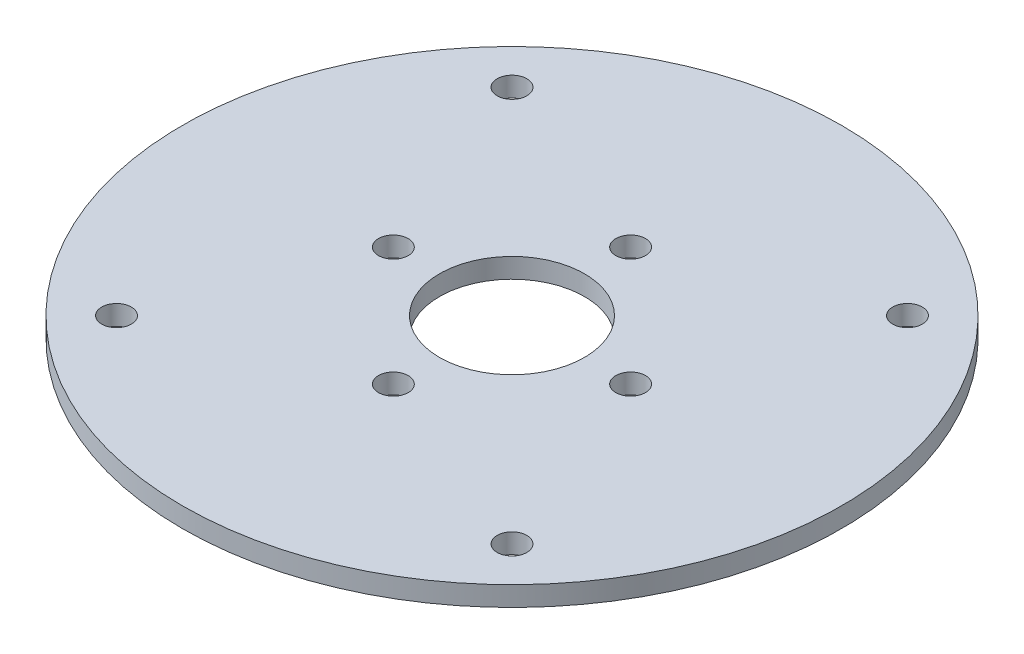
ISO-10303-21;
HEADER;
FILE_DESCRIPTION(('STEP AP214'),'2;1');
FILE_NAME('part.step','',(''),(''),'','','');
FILE_SCHEMA(('AUTOMOTIVE_DESIGN { 1 0 10303 214 1 1 1 1 }'));
ENDSEC;
DATA;
#1=APPLICATION_CONTEXT('core data for automotive mechanical design processes');
#2=APPLICATION_PROTOCOL_DEFINITION('international standard','automotive_design',2000,#1);
#3=PRODUCT_CONTEXT('',#1,'mechanical');
#4=PRODUCT('Part','Part','',(#3));
#5=PRODUCT_RELATED_PRODUCT_CATEGORY('part','',(#4));
#6=PRODUCT_DEFINITION_FORMATION('','',#4);
#7=PRODUCT_DEFINITION_CONTEXT('part definition',#1,'design');
#8=PRODUCT_DEFINITION('design','',#6,#7);
#9=PRODUCT_DEFINITION_SHAPE('','',#8);
#10=(LENGTH_UNIT() NAMED_UNIT(*) SI_UNIT(.MILLI.,.METRE.));
#11=(NAMED_UNIT(*) PLANE_ANGLE_UNIT() SI_UNIT($,.RADIAN.));
#12=(NAMED_UNIT(*) SI_UNIT($,.STERADIAN.) SOLID_ANGLE_UNIT());
#13=UNCERTAINTY_MEASURE_WITH_UNIT(LENGTH_MEASURE(1.E-05),#10,'distance_accuracy_value','');
#14=(GEOMETRIC_REPRESENTATION_CONTEXT(3) GLOBAL_UNCERTAINTY_ASSIGNED_CONTEXT((#13)) GLOBAL_UNIT_ASSIGNED_CONTEXT((#10,
#11,#12)) REPRESENTATION_CONTEXT('',''));
#15=CARTESIAN_POINT('',(0.,0.,0.));
#16=DIRECTION('',(0.,0.,1.));
#17=DIRECTION('',(1.,0.,0.));
#18=AXIS2_PLACEMENT_3D('',#15,#16,#17);
#19=CARTESIAN_POINT('',(0.,3.,0.));
#20=DIRECTION('',(0.,-1.,0.));
#21=DIRECTION('',(0.,0.,-1.));
#22=AXIS2_PLACEMENT_3D('',#19,#20,#21);
#23=CYLINDRICAL_SURFACE('',#22,50.);
#24=CARTESIAN_POINT('',(0.,3.,0.));
#25=DIRECTION('',(0.,1.,0.));
#26=DIRECTION('',(0.,0.,1.));
#27=AXIS2_PLACEMENT_3D('',#24,#25,#26);
#28=CIRCLE('',#27,50.);
#29=CARTESIAN_POINT('',(0.,3.,50.));
#30=VERTEX_POINT('',#29);
#31=EDGE_CURVE('E10',#30,#30,#28,.T.);
#32=ORIENTED_EDGE('',*,*,#31,.F.);
#33=EDGE_LOOP('',(#32));
#34=FACE_BOUND('',#33,.T.);
#35=CARTESIAN_POINT('',(0.,0.,0.));
#36=DIRECTION('',(0.,1.,0.));
#37=DIRECTION('',(0.,0.,1.));
#38=AXIS2_PLACEMENT_3D('',#35,#36,#37);
#39=CIRCLE('',#38,50.);
#40=CARTESIAN_POINT('',(0.,0.,50.));
#41=VERTEX_POINT('',#40);
#42=EDGE_CURVE('E36',#41,#41,#39,.T.);
#43=ORIENTED_EDGE('',*,*,#42,.T.);
#44=EDGE_LOOP('',(#43));
#45=FACE_BOUND('',#44,.T.);
#46=ADVANCED_FACE('F33',(#34,#45),#23,.T.);
#47=CARTESIAN_POINT('',(0.,3.,0.));
#48=DIRECTION('',(0.,1.,0.));
#49=DIRECTION('',(0.,0.,1.));
#50=AXIS2_PLACEMENT_3D('',#47,#48,#49);
#51=PLANE('',#50);
#52=CARTESIAN_POINT('',(0.,3.,0.));
#53=DIRECTION('',(0.,1.,0.));
#54=DIRECTION('',(0.,0.,1.));
#55=AXIS2_PLACEMENT_3D('',#52,#53,#54);
#56=CIRCLE('',#55,11.);
#57=CARTESIAN_POINT('',(0.,3.,11.));
#58=VERTEX_POINT('',#57);
#59=EDGE_CURVE('E79',#58,#58,#56,.T.);
#60=ORIENTED_EDGE('',*,*,#59,.F.);
#61=EDGE_LOOP('',(#60));
#62=FACE_BOUND('',#61,.T.);
#63=CARTESIAN_POINT('',(30.0000000000017,3.,29.9999999999983));
#64=DIRECTION('',(0.,1.,0.));
#65=DIRECTION('',(0.,0.,1.));
#66=AXIS2_PLACEMENT_3D('',#63,#64,#65);
#67=CIRCLE('',#66,2.25000000000238);
#68=CARTESIAN_POINT('',(30.0000000000017,3.,32.2500000000007));
#69=VERTEX_POINT('',#68);
#70=EDGE_CURVE('E70',#69,#69,#67,.T.);
#71=ORIENTED_EDGE('',*,*,#70,.F.);
#72=EDGE_LOOP('',(#71));
#73=FACE_BOUND('',#72,.T.);
#74=CARTESIAN_POINT('',(-29.9999999999983,3.,30.));
#75=DIRECTION('',(0.,1.,0.));
#76=DIRECTION('',(0.,0.,1.));
#77=AXIS2_PLACEMENT_3D('',#74,#75,#76);
#78=CIRCLE('',#77,2.2500000000009);
#79=CARTESIAN_POINT('',(-29.9999999999983,3.,32.2500000000009));
#80=VERTEX_POINT('',#79);
#81=EDGE_CURVE('E64',#80,#80,#78,.T.);
#82=ORIENTED_EDGE('',*,*,#81,.F.);
#83=EDGE_LOOP('',(#82));
#84=FACE_BOUND('',#83,.T.);
#85=CARTESIAN_POINT('',(0.,3.,-18.0000000000017));
#86=DIRECTION('',(0.,1.,0.));
#87=DIRECTION('',(0.,0.,1.));
#88=AXIS2_PLACEMENT_3D('',#85,#86,#87);
#89=CIRCLE('',#88,2.25000000000163);
#90=CARTESIAN_POINT('',(0.,3.,-15.7500000000001));
#91=VERTEX_POINT('',#90);
#92=EDGE_CURVE('E58',#91,#91,#89,.T.);
#93=ORIENTED_EDGE('',*,*,#92,.F.);
#94=EDGE_LOOP('',(#93));
#95=FACE_BOUND('',#94,.T.);
#96=CARTESIAN_POINT('',(30.,3.,-30.0000000000017));
#97=DIRECTION('',(0.,1.,0.));
#98=DIRECTION('',(0.,0.,1.));
#99=AXIS2_PLACEMENT_3D('',#96,#97,#98);
#100=CIRCLE('',#99,2.25000000000174);
#101=CARTESIAN_POINT('',(30.,3.,-27.7499999999999));
#102=VERTEX_POINT('',#101);
#103=EDGE_CURVE('E51',#102,#102,#100,.T.);
#104=ORIENTED_EDGE('',*,*,#103,.F.);
#105=EDGE_LOOP('',(#104));
#106=FACE_BOUND('',#105,.T.);
#107=CARTESIAN_POINT('',(-30.,3.,-30.));
#108=DIRECTION('',(0.,1.,0.));
#109=DIRECTION('',(0.,0.,1.));
#110=AXIS2_PLACEMENT_3D('',#107,#108,#109);
#111=CIRCLE('',#110,2.25);
#112=CARTESIAN_POINT('',(-30.,3.,-27.75));
#113=VERTEX_POINT('',#112);
#114=EDGE_CURVE('E88',#113,#113,#111,.T.);
#115=ORIENTED_EDGE('',*,*,#114,.F.);
#116=EDGE_LOOP('',(#115));
#117=FACE_BOUND('',#116,.T.);
#118=CARTESIAN_POINT('',(1.69166212924562E-12,3.,18.));
#119=DIRECTION('',(0.,1.,0.));
#120=DIRECTION('',(0.,0.,1.));
#121=AXIS2_PLACEMENT_3D('',#118,#119,#120);
#122=CIRCLE('',#121,2.25000000000056);
#123=CARTESIAN_POINT('',(1.69166212924562E-12,3.,20.2500000000006));
#124=VERTEX_POINT('',#123);
#125=EDGE_CURVE('E82',#124,#124,#122,.T.);
#126=ORIENTED_EDGE('',*,*,#125,.F.);
#127=EDGE_LOOP('',(#126));
#128=FACE_BOUND('',#127,.T.);
#129=CARTESIAN_POINT('',(18.0000000000017,3.,-1.68362105322248E-12));
#130=DIRECTION('',(0.,1.,0.));
#131=DIRECTION('',(0.,0.,1.));
#132=AXIS2_PLACEMENT_3D('',#129,#130,#131);
#133=CIRCLE('',#132,2.25000000000215);
#134=CARTESIAN_POINT('',(18.0000000000017,3.,2.25000000000046));
#135=VERTEX_POINT('',#134);
#136=EDGE_CURVE('E75',#135,#135,#133,.T.);
#137=ORIENTED_EDGE('',*,*,#136,.F.);
#138=EDGE_LOOP('',(#137));
#139=FACE_BOUND('',#138,.T.);
#140=CARTESIAN_POINT('',(-18.,3.,0.));
#141=DIRECTION('',(0.,1.,0.));
#142=DIRECTION('',(0.,0.,1.));
#143=AXIS2_PLACEMENT_3D('',#140,#141,#142);
#144=CIRCLE('',#143,2.25);
#145=CARTESIAN_POINT('',(-18.,3.,2.25));
#146=VERTEX_POINT('',#145);
#147=EDGE_CURVE('E43',#146,#146,#144,.T.);
#148=ORIENTED_EDGE('',*,*,#147,.F.);
#149=EDGE_LOOP('',(#148));
#150=FACE_BOUND('',#149,.T.);
#151=ORIENTED_EDGE('',*,*,#31,.T.);
#152=EDGE_LOOP('',(#151));
#153=FACE_BOUND('',#152,.T.);
#154=ADVANCED_FACE('F102',(#62,#73,#84,#95,#106,#117,#128,#139,#150,#153),#51,.T.);
#155=CARTESIAN_POINT('',(0.,0.,0.));
#156=DIRECTION('',(0.,1.,0.));
#157=DIRECTION('',(0.,0.,1.));
#158=AXIS2_PLACEMENT_3D('',#155,#156,#157);
#159=PLANE('',#158);
#160=CARTESIAN_POINT('',(0.,0.,0.));
#161=DIRECTION('',(0.,1.,0.));
#162=DIRECTION('',(0.,0.,1.));
#163=AXIS2_PLACEMENT_3D('',#160,#161,#162);
#164=CIRCLE('',#163,11.);
#165=CARTESIAN_POINT('',(0.,0.,11.));
#166=VERTEX_POINT('',#165);
#167=EDGE_CURVE('E93',#166,#166,#164,.T.);
#168=ORIENTED_EDGE('',*,*,#167,.T.);
#169=EDGE_LOOP('',(#168));
#170=FACE_BOUND('',#169,.T.);
#171=CARTESIAN_POINT('',(30.0000000000017,0.,29.9999999999983));
#172=DIRECTION('',(0.,1.,0.));
#173=DIRECTION('',(0.,0.,1.));
#174=AXIS2_PLACEMENT_3D('',#171,#172,#173);
#175=CIRCLE('',#174,2.25000000000238);
#176=CARTESIAN_POINT('',(30.0000000000017,0.,32.2500000000007));
#177=VERTEX_POINT('',#176);
#178=EDGE_CURVE('E48',#177,#177,#175,.T.);
#179=ORIENTED_EDGE('',*,*,#178,.T.);
#180=EDGE_LOOP('',(#179));
#181=FACE_BOUND('',#180,.T.);
#182=CARTESIAN_POINT('',(-29.9999999999983,0.,30.));
#183=DIRECTION('',(0.,1.,0.));
#184=DIRECTION('',(0.,0.,1.));
#185=AXIS2_PLACEMENT_3D('',#182,#183,#184);
#186=CIRCLE('',#185,2.2500000000009);
#187=CARTESIAN_POINT('',(-29.9999999999983,0.,32.2500000000009));
#188=VERTEX_POINT('',#187);
#189=EDGE_CURVE('E67',#188,#188,#186,.T.);
#190=ORIENTED_EDGE('',*,*,#189,.T.);
#191=EDGE_LOOP('',(#190));
#192=FACE_BOUND('',#191,.T.);
#193=CARTESIAN_POINT('',(0.,0.,-18.0000000000017));
#194=DIRECTION('',(0.,1.,0.));
#195=DIRECTION('',(0.,0.,1.));
#196=AXIS2_PLACEMENT_3D('',#193,#194,#195);
#197=CIRCLE('',#196,2.25000000000163);
#198=CARTESIAN_POINT('',(0.,0.,-15.7500000000001));
#199=VERTEX_POINT('',#198);
#200=EDGE_CURVE('E61',#199,#199,#197,.T.);
#201=ORIENTED_EDGE('',*,*,#200,.T.);
#202=EDGE_LOOP('',(#201));
#203=FACE_BOUND('',#202,.T.);
#204=CARTESIAN_POINT('',(30.,0.,-30.0000000000017));
#205=DIRECTION('',(0.,1.,0.));
#206=DIRECTION('',(0.,0.,1.));
#207=AXIS2_PLACEMENT_3D('',#204,#205,#206);
#208=CIRCLE('',#207,2.25000000000174);
#209=CARTESIAN_POINT('',(30.,0.,-27.7499999999999));
#210=VERTEX_POINT('',#209);
#211=EDGE_CURVE('E54',#210,#210,#208,.T.);
#212=ORIENTED_EDGE('',*,*,#211,.T.);
#213=EDGE_LOOP('',(#212));
#214=FACE_BOUND('',#213,.T.);
#215=CARTESIAN_POINT('',(-30.,0.,-30.));
#216=DIRECTION('',(0.,1.,0.));
#217=DIRECTION('',(0.,0.,1.));
#218=AXIS2_PLACEMENT_3D('',#215,#216,#217);
#219=CIRCLE('',#218,2.25);
#220=CARTESIAN_POINT('',(-30.,0.,-27.75));
#221=VERTEX_POINT('',#220);
#222=EDGE_CURVE('E55',#221,#221,#219,.T.);
#223=ORIENTED_EDGE('',*,*,#222,.T.);
#224=EDGE_LOOP('',(#223));
#225=FACE_BOUND('',#224,.T.);
#226=CARTESIAN_POINT('',(1.69166212924562E-12,0.,18.));
#227=DIRECTION('',(0.,1.,0.));
#228=DIRECTION('',(0.,0.,1.));
#229=AXIS2_PLACEMENT_3D('',#226,#227,#228);
#230=CIRCLE('',#229,2.25000000000056);
#231=CARTESIAN_POINT('',(1.69166212924562E-12,0.,20.2500000000006));
#232=VERTEX_POINT('',#231);
#233=EDGE_CURVE('E85',#232,#232,#230,.T.);
#234=ORIENTED_EDGE('',*,*,#233,.T.);
#235=EDGE_LOOP('',(#234));
#236=FACE_BOUND('',#235,.T.);
#237=CARTESIAN_POINT('',(18.0000000000017,0.,-1.68362105322248E-12));
#238=DIRECTION('',(0.,1.,0.));
#239=DIRECTION('',(0.,0.,1.));
#240=AXIS2_PLACEMENT_3D('',#237,#238,#239);
#241=CIRCLE('',#240,2.25000000000215);
#242=CARTESIAN_POINT('',(18.0000000000017,0.,2.25000000000046));
#243=VERTEX_POINT('',#242);
#244=EDGE_CURVE('E78',#243,#243,#241,.T.);
#245=ORIENTED_EDGE('',*,*,#244,.T.);
#246=EDGE_LOOP('',(#245));
#247=FACE_BOUND('',#246,.T.);
#248=CARTESIAN_POINT('',(-18.,0.,0.));
#249=DIRECTION('',(0.,1.,0.));
#250=DIRECTION('',(0.,0.,1.));
#251=AXIS2_PLACEMENT_3D('',#248,#249,#250);
#252=CIRCLE('',#251,2.25);
#253=CARTESIAN_POINT('',(-18.,0.,2.25));
#254=VERTEX_POINT('',#253);
#255=EDGE_CURVE('E45',#254,#254,#252,.T.);
#256=ORIENTED_EDGE('',*,*,#255,.T.);
#257=EDGE_LOOP('',(#256));
#258=FACE_BOUND('',#257,.T.);
#259=ORIENTED_EDGE('',*,*,#42,.F.);
#260=EDGE_LOOP('',(#259));
#261=FACE_BOUND('',#260,.T.);
#262=ADVANCED_FACE('F105',(#170,#181,#192,#203,#214,#225,#236,#247,#258,#261),#159,.F.);
#263=CARTESIAN_POINT('',(-18.,3.,0.));
#264=DIRECTION('',(0.,-1.,0.));
#265=DIRECTION('',(0.,0.,-1.));
#266=AXIS2_PLACEMENT_3D('',#263,#264,#265);
#267=CYLINDRICAL_SURFACE('',#266,2.25);
#268=ORIENTED_EDGE('',*,*,#147,.T.);
#269=EDGE_LOOP('',(#268));
#270=FACE_BOUND('',#269,.T.);
#271=ORIENTED_EDGE('',*,*,#255,.F.);
#272=EDGE_LOOP('',(#271));
#273=FACE_BOUND('',#272,.T.);
#274=ADVANCED_FACE('F123',(#270,#273),#267,.F.);
#275=CARTESIAN_POINT('',(18.0000000000017,3.,-1.68362105322248E-12));
#276=DIRECTION('',(0.,-1.,0.));
#277=DIRECTION('',(0.,0.,-1.));
#278=AXIS2_PLACEMENT_3D('',#275,#276,#277);
#279=CYLINDRICAL_SURFACE('',#278,2.25000000000215);
#280=ORIENTED_EDGE('',*,*,#136,.T.);
#281=EDGE_LOOP('',(#280));
#282=FACE_BOUND('',#281,.T.);
#283=ORIENTED_EDGE('',*,*,#244,.F.);
#284=EDGE_LOOP('',(#283));
#285=FACE_BOUND('',#284,.T.);
#286=ADVANCED_FACE('F126',(#282,#285),#279,.F.);
#287=CARTESIAN_POINT('',(1.69166212924562E-12,3.,18.));
#288=DIRECTION('',(0.,-1.,0.));
#289=DIRECTION('',(0.,0.,-1.));
#290=AXIS2_PLACEMENT_3D('',#287,#288,#289);
#291=CYLINDRICAL_SURFACE('',#290,2.25000000000056);
#292=ORIENTED_EDGE('',*,*,#125,.T.);
#293=EDGE_LOOP('',(#292));
#294=FACE_BOUND('',#293,.T.);
#295=ORIENTED_EDGE('',*,*,#233,.F.);
#296=EDGE_LOOP('',(#295));
#297=FACE_BOUND('',#296,.T.);
#298=ADVANCED_FACE('F159',(#294,#297),#291,.F.);
#299=CARTESIAN_POINT('',(-30.,3.,-30.));
#300=DIRECTION('',(0.,-1.,0.));
#301=DIRECTION('',(0.,0.,-1.));
#302=AXIS2_PLACEMENT_3D('',#299,#300,#301);
#303=CYLINDRICAL_SURFACE('',#302,2.25);
#304=ORIENTED_EDGE('',*,*,#114,.T.);
#305=EDGE_LOOP('',(#304));
#306=FACE_BOUND('',#305,.T.);
#307=ORIENTED_EDGE('',*,*,#222,.F.);
#308=EDGE_LOOP('',(#307));
#309=FACE_BOUND('',#308,.T.);
#310=ADVANCED_FACE('F167',(#306,#309),#303,.F.);
#311=CARTESIAN_POINT('',(30.,3.,-30.0000000000017));
#312=DIRECTION('',(0.,-1.,0.));
#313=DIRECTION('',(0.,0.,-1.));
#314=AXIS2_PLACEMENT_3D('',#311,#312,#313);
#315=CYLINDRICAL_SURFACE('',#314,2.25000000000174);
#316=ORIENTED_EDGE('',*,*,#103,.T.);
#317=EDGE_LOOP('',(#316));
#318=FACE_BOUND('',#317,.T.);
#319=ORIENTED_EDGE('',*,*,#211,.F.);
#320=EDGE_LOOP('',(#319));
#321=FACE_BOUND('',#320,.T.);
#322=ADVANCED_FACE('F175',(#318,#321),#315,.F.);
#323=CARTESIAN_POINT('',(0.,3.,-18.0000000000017));
#324=DIRECTION('',(0.,-1.,0.));
#325=DIRECTION('',(0.,0.,-1.));
#326=AXIS2_PLACEMENT_3D('',#323,#324,#325);
#327=CYLINDRICAL_SURFACE('',#326,2.25000000000163);
#328=ORIENTED_EDGE('',*,*,#92,.T.);
#329=EDGE_LOOP('',(#328));
#330=FACE_BOUND('',#329,.T.);
#331=ORIENTED_EDGE('',*,*,#200,.F.);
#332=EDGE_LOOP('',(#331));
#333=FACE_BOUND('',#332,.T.);
#334=ADVANCED_FACE('F183',(#330,#333),#327,.F.);
#335=CARTESIAN_POINT('',(-29.9999999999983,3.,30.));
#336=DIRECTION('',(0.,-1.,0.));
#337=DIRECTION('',(0.,0.,-1.));
#338=AXIS2_PLACEMENT_3D('',#335,#336,#337);
#339=CYLINDRICAL_SURFACE('',#338,2.2500000000009);
#340=ORIENTED_EDGE('',*,*,#81,.T.);
#341=EDGE_LOOP('',(#340));
#342=FACE_BOUND('',#341,.T.);
#343=ORIENTED_EDGE('',*,*,#189,.F.);
#344=EDGE_LOOP('',(#343));
#345=FACE_BOUND('',#344,.T.);
#346=ADVANCED_FACE('F191',(#342,#345),#339,.F.);
#347=CARTESIAN_POINT('',(30.0000000000017,3.,29.9999999999983));
#348=DIRECTION('',(0.,-1.,0.));
#349=DIRECTION('',(0.,0.,-1.));
#350=AXIS2_PLACEMENT_3D('',#347,#348,#349);
#351=CYLINDRICAL_SURFACE('',#350,2.25000000000238);
#352=ORIENTED_EDGE('',*,*,#70,.T.);
#353=EDGE_LOOP('',(#352));
#354=FACE_BOUND('',#353,.T.);
#355=ORIENTED_EDGE('',*,*,#178,.F.);
#356=EDGE_LOOP('',(#355));
#357=FACE_BOUND('',#356,.T.);
#358=ADVANCED_FACE('F199',(#354,#357),#351,.F.);
#359=CARTESIAN_POINT('',(0.,3.,0.));
#360=DIRECTION('',(0.,-1.,0.));
#361=DIRECTION('',(0.,0.,-1.));
#362=AXIS2_PLACEMENT_3D('',#359,#360,#361);
#363=CYLINDRICAL_SURFACE('',#362,11.);
#364=ORIENTED_EDGE('',*,*,#59,.T.);
#365=EDGE_LOOP('',(#364));
#366=FACE_BOUND('',#365,.T.);
#367=ORIENTED_EDGE('',*,*,#167,.F.);
#368=EDGE_LOOP('',(#367));
#369=FACE_BOUND('',#368,.T.);
#370=ADVANCED_FACE('F99',(#366,#369),#363,.F.);
#371=CLOSED_SHELL('',(#46,#154,#262,#274,#286,#298,#310,#322,#334,#346,#358,#370));
#372=MANIFOLD_SOLID_BREP('B2',#371);
#373=ADVANCED_BREP_SHAPE_REPRESENTATION('',(#18,#372),#14);
#374=SHAPE_DEFINITION_REPRESENTATION(#9,#373);
ENDSEC;
END-ISO-10303-21;
